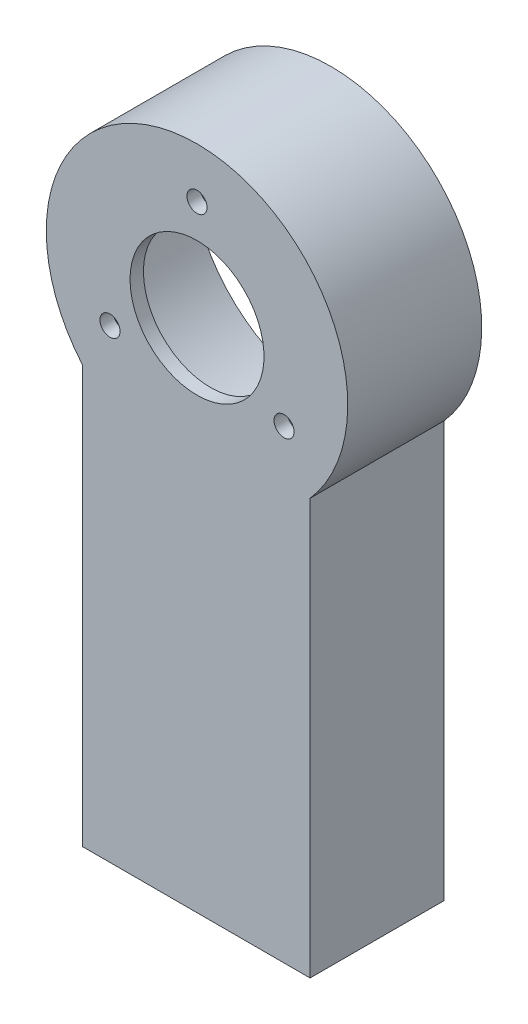
ISO-10303-21;
HEADER;
FILE_DESCRIPTION(('STEP AP214'),'2;1');
FILE_NAME('part.step','',(''),(''),'','','');
FILE_SCHEMA(('AUTOMOTIVE_DESIGN { 1 0 10303 214 1 1 1 1 }'));
ENDSEC;
DATA;
#1=APPLICATION_CONTEXT('core data for automotive mechanical design processes');
#2=APPLICATION_PROTOCOL_DEFINITION('international standard','automotive_design',2000,#1);
#3=PRODUCT_CONTEXT('',#1,'mechanical');
#4=PRODUCT('Part','Part','',(#3));
#5=PRODUCT_RELATED_PRODUCT_CATEGORY('part','',(#4));
#6=PRODUCT_DEFINITION_FORMATION('','',#4);
#7=PRODUCT_DEFINITION_CONTEXT('part definition',#1,'design');
#8=PRODUCT_DEFINITION('design','',#6,#7);
#9=PRODUCT_DEFINITION_SHAPE('','',#8);
#10=(LENGTH_UNIT() NAMED_UNIT(*) SI_UNIT(.MILLI.,.METRE.));
#11=(NAMED_UNIT(*) PLANE_ANGLE_UNIT() SI_UNIT($,.RADIAN.));
#12=(NAMED_UNIT(*) SI_UNIT($,.STERADIAN.) SOLID_ANGLE_UNIT());
#13=UNCERTAINTY_MEASURE_WITH_UNIT(LENGTH_MEASURE(1.E-05),#10,'distance_accuracy_value','');
#14=(GEOMETRIC_REPRESENTATION_CONTEXT(3) GLOBAL_UNCERTAINTY_ASSIGNED_CONTEXT((#13)) GLOBAL_UNIT_ASSIGNED_CONTEXT((#10,
#11,#12)) REPRESENTATION_CONTEXT('',''));
#15=CARTESIAN_POINT('',(0.,0.,0.));
#16=DIRECTION('',(0.,0.,1.));
#17=DIRECTION('',(1.,0.,0.));
#18=AXIS2_PLACEMENT_3D('',#15,#16,#17);
#19=CARTESIAN_POINT('',(0.,0.,20.));
#20=DIRECTION('',(0.,0.,-1.));
#21=DIRECTION('',(-1.,0.,0.));
#22=AXIS2_PLACEMENT_3D('',#19,#20,#21);
#23=CYLINDRICAL_SURFACE('',#22,10.);
#24=CARTESIAN_POINT('',(0.,0.,20.));
#25=DIRECTION('',(0.,0.,-1.));
#26=DIRECTION('',(-1.,0.,0.));
#27=AXIS2_PLACEMENT_3D('',#24,#25,#26);
#28=CIRCLE('',#27,10.);
#29=CARTESIAN_POINT('',(-10.,0.,20.));
#30=VERTEX_POINT('',#29);
#31=EDGE_CURVE('E103',#30,#30,#28,.T.);
#32=ORIENTED_EDGE('',*,*,#31,.F.);
#33=EDGE_LOOP('',(#32));
#34=FACE_BOUND('',#33,.T.);
#35=CARTESIAN_POINT('',(0.,0.,18.));
#36=DIRECTION('',(0.,0.,-1.));
#37=DIRECTION('',(-1.,0.,0.));
#38=AXIS2_PLACEMENT_3D('',#35,#36,#37);
#39=CIRCLE('',#38,10.);
#40=CARTESIAN_POINT('',(-10.,0.,18.));
#41=VERTEX_POINT('',#40);
#42=EDGE_CURVE('E243',#41,#41,#39,.F.);
#43=ORIENTED_EDGE('',*,*,#42,.F.);
#44=EDGE_LOOP('',(#43));
#45=FACE_BOUND('',#44,.T.);
#46=ADVANCED_FACE('F35',(#34,#45),#23,.F.);
#47=CARTESIAN_POINT('',(12.9903810567659,-7.50000000000037,20.));
#48=DIRECTION('',(0.,0.,-1.));
#49=DIRECTION('',(-1.,0.,0.));
#50=AXIS2_PLACEMENT_3D('',#47,#48,#49);
#51=CYLINDRICAL_SURFACE('',#50,1.50000000000086);
#52=CARTESIAN_POINT('',(12.9903810567659,-7.50000000000037,20.));
#53=DIRECTION('',(0.,0.,-1.));
#54=DIRECTION('',(-1.,0.,0.));
#55=AXIS2_PLACEMENT_3D('',#52,#53,#54);
#56=CIRCLE('',#55,1.50000000000086);
#57=CARTESIAN_POINT('',(11.4903810567651,-7.50000000000037,20.));
#58=VERTEX_POINT('',#57);
#59=EDGE_CURVE('E253',#58,#58,#56,.T.);
#60=ORIENTED_EDGE('',*,*,#59,.F.);
#61=EDGE_LOOP('',(#60));
#62=FACE_BOUND('',#61,.T.);
#63=CARTESIAN_POINT('',(12.9903810567659,-7.50000000000037,18.));
#64=DIRECTION('',(0.,0.,-1.));
#65=DIRECTION('',(-1.,0.,0.));
#66=AXIS2_PLACEMENT_3D('',#63,#64,#65);
#67=CIRCLE('',#66,1.50000000000086);
#68=CARTESIAN_POINT('',(11.4903810567651,-7.50000000000037,18.));
#69=VERTEX_POINT('',#68);
#70=EDGE_CURVE('E240',#69,#69,#67,.F.);
#71=ORIENTED_EDGE('',*,*,#70,.F.);
#72=EDGE_LOOP('',(#71));
#73=FACE_BOUND('',#72,.T.);
#74=ADVANCED_FACE('F124',(#62,#73),#51,.F.);
#75=CARTESIAN_POINT('',(-12.9903810567672,-7.49999999999963,20.));
#76=DIRECTION('',(0.,0.,-1.));
#77=DIRECTION('',(-1.,0.,0.));
#78=AXIS2_PLACEMENT_3D('',#75,#76,#77);
#79=CYLINDRICAL_SURFACE('',#78,1.50000000000057);
#80=CARTESIAN_POINT('',(-12.9903810567672,-7.49999999999963,20.));
#81=DIRECTION('',(0.,0.,-1.));
#82=DIRECTION('',(-1.,0.,0.));
#83=AXIS2_PLACEMENT_3D('',#80,#81,#82);
#84=CIRCLE('',#83,1.50000000000057);
#85=CARTESIAN_POINT('',(-14.4903810567678,-7.49999999999963,20.));
#86=VERTEX_POINT('',#85);
#87=EDGE_CURVE('E235',#86,#86,#84,.T.);
#88=ORIENTED_EDGE('',*,*,#87,.F.);
#89=EDGE_LOOP('',(#88));
#90=FACE_BOUND('',#89,.T.);
#91=CARTESIAN_POINT('',(-12.9903810567672,-7.49999999999963,18.));
#92=DIRECTION('',(0.,0.,-1.));
#93=DIRECTION('',(-1.,0.,0.));
#94=AXIS2_PLACEMENT_3D('',#91,#92,#93);
#95=CIRCLE('',#94,1.50000000000057);
#96=CARTESIAN_POINT('',(-14.4903810567678,-7.49999999999963,18.));
#97=VERTEX_POINT('',#96);
#98=EDGE_CURVE('E238',#97,#97,#95,.F.);
#99=ORIENTED_EDGE('',*,*,#98,.F.);
#100=EDGE_LOOP('',(#99));
#101=FACE_BOUND('',#100,.T.);
#102=ADVANCED_FACE('F120',(#90,#101),#79,.F.);
#103=CARTESIAN_POINT('',(0.,15.,20.));
#104=DIRECTION('',(0.,0.,-1.));
#105=DIRECTION('',(-1.,0.,0.));
#106=AXIS2_PLACEMENT_3D('',#103,#104,#105);
#107=CYLINDRICAL_SURFACE('',#106,1.5);
#108=CARTESIAN_POINT('',(0.,15.,20.));
#109=DIRECTION('',(0.,0.,-1.));
#110=DIRECTION('',(-1.,0.,0.));
#111=AXIS2_PLACEMENT_3D('',#108,#109,#110);
#112=CIRCLE('',#111,1.5);
#113=CARTESIAN_POINT('',(-1.5,15.,20.));
#114=VERTEX_POINT('',#113);
#115=EDGE_CURVE('E254',#114,#114,#112,.T.);
#116=ORIENTED_EDGE('',*,*,#115,.F.);
#117=EDGE_LOOP('',(#116));
#118=FACE_BOUND('',#117,.T.);
#119=CARTESIAN_POINT('',(0.,15.,18.));
#120=DIRECTION('',(0.,0.,-1.));
#121=DIRECTION('',(-1.,0.,0.));
#122=AXIS2_PLACEMENT_3D('',#119,#120,#121);
#123=CIRCLE('',#122,1.5);
#124=CARTESIAN_POINT('',(-1.5,15.,18.));
#125=VERTEX_POINT('',#124);
#126=EDGE_CURVE('E39',#125,#125,#123,.F.);
#127=ORIENTED_EDGE('',*,*,#126,.F.);
#128=EDGE_LOOP('',(#127));
#129=FACE_BOUND('',#128,.T.);
#130=ADVANCED_FACE('F115',(#118,#129),#107,.F.);
#131=CARTESIAN_POINT('',(16.8763744860903,0.,20.));
#132=DIRECTION('',(1.,0.,0.));
#133=DIRECTION('',(0.,1.,0.));
#134=AXIS2_PLACEMENT_3D('',#131,#132,#133);
#135=PLANE('',#134);
#136=DIRECTION('',(0.,-1.,0.));
#137=VECTOR('',#136,1.);
#138=CARTESIAN_POINT('',(16.8763744860903,0.,0.));
#139=LINE('',#138,#137);
#140=CARTESIAN_POINT('',(16.8763744860903,-14.8807924589129,0.));
#141=VERTEX_POINT('',#140);
#142=CARTESIAN_POINT('',(16.8763744860903,-76.9,0.));
#143=VERTEX_POINT('',#142);
#144=EDGE_CURVE('E100',#141,#143,#139,.T.);
#145=ORIENTED_EDGE('',*,*,#144,.F.);
#146=DIRECTION('',(0.,0.,-1.));
#147=VECTOR('',#146,1.);
#148=CARTESIAN_POINT('',(16.8763744860903,-14.8807924589129,20.));
#149=LINE('',#148,#147);
#150=CARTESIAN_POINT('',(16.8763744860903,-14.8807924589129,20.));
#151=VERTEX_POINT('',#150);
#152=EDGE_CURVE('E11',#151,#141,#149,.T.);
#153=ORIENTED_EDGE('',*,*,#152,.F.);
#154=DIRECTION('',(0.,-1.,0.));
#155=VECTOR('',#154,1.);
#156=CARTESIAN_POINT('',(16.8763744860903,0.,20.));
#157=LINE('',#156,#155);
#158=CARTESIAN_POINT('',(16.8763744860903,-76.9,20.));
#159=VERTEX_POINT('',#158);
#160=EDGE_CURVE('E87',#151,#159,#157,.T.);
#161=ORIENTED_EDGE('',*,*,#160,.T.);
#162=DIRECTION('',(0.,0.,-1.));
#163=VECTOR('',#162,1.);
#164=CARTESIAN_POINT('',(16.8763744860903,-76.9,20.));
#165=LINE('',#164,#163);
#166=EDGE_CURVE('E76',#159,#143,#165,.T.);
#167=ORIENTED_EDGE('',*,*,#166,.T.);
#168=EDGE_LOOP('',(#145,#153,#161,#167));
#169=FACE_BOUND('',#168,.T.);
#170=ADVANCED_FACE('F37',(#169),#135,.T.);
#171=CARTESIAN_POINT('',(0.,0.,20.));
#172=DIRECTION('',(0.,0.,-1.));
#173=DIRECTION('',(-1.,0.,0.));
#174=AXIS2_PLACEMENT_3D('',#171,#172,#173);
#175=CYLINDRICAL_SURFACE('',#174,22.5);
#176=CARTESIAN_POINT('',(0.,0.,0.));
#177=DIRECTION('',(0.,0.,1.));
#178=DIRECTION('',(1.,0.,0.));
#179=AXIS2_PLACEMENT_3D('',#176,#177,#178);
#180=CIRCLE('',#179,22.5);
#181=CARTESIAN_POINT('',(-17.1236255139097,-14.5955969134319,0.));
#182=VERTEX_POINT('',#181);
#183=EDGE_CURVE('E92',#141,#182,#180,.T.);
#184=ORIENTED_EDGE('',*,*,#183,.T.);
#185=DIRECTION('',(0.,0.,-1.));
#186=VECTOR('',#185,1.);
#187=CARTESIAN_POINT('',(-17.1236255139097,-14.5955969134319,20.));
#188=LINE('',#187,#186);
#189=CARTESIAN_POINT('',(-17.1236255139097,-14.5955969134319,20.));
#190=VERTEX_POINT('',#189);
#191=EDGE_CURVE('E45',#190,#182,#188,.T.);
#192=ORIENTED_EDGE('',*,*,#191,.F.);
#193=CARTESIAN_POINT('',(0.,0.,20.));
#194=DIRECTION('',(0.,0.,1.));
#195=DIRECTION('',(1.,0.,0.));
#196=AXIS2_PLACEMENT_3D('',#193,#194,#195);
#197=CIRCLE('',#196,22.5);
#198=EDGE_CURVE('E82',#151,#190,#197,.T.);
#199=ORIENTED_EDGE('',*,*,#198,.F.);
#200=ORIENTED_EDGE('',*,*,#152,.T.);
#201=EDGE_LOOP('',(#184,#192,#199,#200));
#202=FACE_BOUND('',#201,.T.);
#203=ADVANCED_FACE('F90',(#202),#175,.T.);
#204=CARTESIAN_POINT('',(-17.1236255139097,0.,20.));
#205=DIRECTION('',(1.,0.,0.));
#206=DIRECTION('',(0.,1.,0.));
#207=AXIS2_PLACEMENT_3D('',#204,#205,#206);
#208=PLANE('',#207);
#209=DIRECTION('',(0.,-1.,0.));
#210=VECTOR('',#209,1.);
#211=CARTESIAN_POINT('',(-17.1236255139097,0.,0.));
#212=LINE('',#211,#210);
#213=CARTESIAN_POINT('',(-17.1236255139097,-76.9,0.));
#214=VERTEX_POINT('',#213);
#215=EDGE_CURVE('E69',#182,#214,#212,.T.);
#216=ORIENTED_EDGE('',*,*,#215,.T.);
#217=DIRECTION('',(0.,0.,-1.));
#218=VECTOR('',#217,1.);
#219=CARTESIAN_POINT('',(-17.1236255139097,-76.9,20.));
#220=LINE('',#219,#218);
#221=CARTESIAN_POINT('',(-17.1236255139097,-76.9,20.));
#222=VERTEX_POINT('',#221);
#223=EDGE_CURVE('E93',#222,#214,#220,.T.);
#224=ORIENTED_EDGE('',*,*,#223,.F.);
#225=DIRECTION('',(0.,-1.,0.));
#226=VECTOR('',#225,1.);
#227=CARTESIAN_POINT('',(-17.1236255139097,0.,20.));
#228=LINE('',#227,#226);
#229=EDGE_CURVE('E86',#190,#222,#228,.T.);
#230=ORIENTED_EDGE('',*,*,#229,.F.);
#231=ORIENTED_EDGE('',*,*,#191,.T.);
#232=EDGE_LOOP('',(#216,#224,#230,#231));
#233=FACE_BOUND('',#232,.T.);
#234=ADVANCED_FACE('F95',(#233),#208,.F.);
#235=CARTESIAN_POINT('',(0.,-76.9,20.));
#236=DIRECTION('',(0.,1.,0.));
#237=DIRECTION('',(0.,0.,1.));
#238=AXIS2_PLACEMENT_3D('',#235,#236,#237);
#239=PLANE('',#238);
#240=DIRECTION('',(1.,0.,0.));
#241=VECTOR('',#240,1.);
#242=CARTESIAN_POINT('',(0.,-76.9,0.));
#243=LINE('',#242,#241);
#244=EDGE_CURVE('E106',#214,#143,#243,.T.);
#245=ORIENTED_EDGE('',*,*,#244,.T.);
#246=ORIENTED_EDGE('',*,*,#166,.F.);
#247=DIRECTION('',(1.,0.,0.));
#248=VECTOR('',#247,1.);
#249=CARTESIAN_POINT('',(0.,-76.9,20.));
#250=LINE('',#249,#248);
#251=EDGE_CURVE('E53',#222,#159,#250,.T.);
#252=ORIENTED_EDGE('',*,*,#251,.F.);
#253=ORIENTED_EDGE('',*,*,#223,.T.);
#254=EDGE_LOOP('',(#245,#246,#252,#253));
#255=FACE_BOUND('',#254,.T.);
#256=ADVANCED_FACE('F111',(#255),#239,.F.);
#257=CARTESIAN_POINT('',(0.,0.,20.));
#258=DIRECTION('',(0.,0.,1.));
#259=DIRECTION('',(1.,0.,0.));
#260=AXIS2_PLACEMENT_3D('',#257,#258,#259);
#261=PLANE('',#260);
#262=ORIENTED_EDGE('',*,*,#115,.T.);
#263=EDGE_LOOP('',(#262));
#264=FACE_BOUND('',#263,.T.);
#265=ORIENTED_EDGE('',*,*,#87,.T.);
#266=EDGE_LOOP('',(#265));
#267=FACE_BOUND('',#266,.T.);
#268=ORIENTED_EDGE('',*,*,#59,.T.);
#269=EDGE_LOOP('',(#268));
#270=FACE_BOUND('',#269,.T.);
#271=ORIENTED_EDGE('',*,*,#31,.T.);
#272=EDGE_LOOP('',(#271));
#273=FACE_BOUND('',#272,.T.);
#274=ORIENTED_EDGE('',*,*,#160,.F.);
#275=ORIENTED_EDGE('',*,*,#198,.T.);
#276=ORIENTED_EDGE('',*,*,#229,.T.);
#277=ORIENTED_EDGE('',*,*,#251,.T.);
#278=EDGE_LOOP('',(#274,#275,#276,#277));
#279=FACE_BOUND('',#278,.T.);
#280=ADVANCED_FACE('F84',(#264,#267,#270,#273,#279),#261,.T.);
#281=CARTESIAN_POINT('',(0.,0.,0.));
#282=DIRECTION('',(0.,0.,1.));
#283=DIRECTION('',(1.,0.,0.));
#284=AXIS2_PLACEMENT_3D('',#281,#282,#283);
#285=PLANE('',#284);
#286=CARTESIAN_POINT('',(0.,0.,0.));
#287=DIRECTION('',(0.,0.,-1.));
#288=DIRECTION('',(-1.,0.,0.));
#289=AXIS2_PLACEMENT_3D('',#286,#287,#288);
#290=CIRCLE('',#289,21.);
#291=CARTESIAN_POINT('',(-21.,0.,0.));
#292=VERTEX_POINT('',#291);
#293=EDGE_CURVE('E248',#292,#292,#290,.T.);
#294=ORIENTED_EDGE('',*,*,#293,.F.);
#295=EDGE_LOOP('',(#294));
#296=FACE_BOUND('',#295,.T.);
#297=ORIENTED_EDGE('',*,*,#144,.T.);
#298=ORIENTED_EDGE('',*,*,#244,.F.);
#299=ORIENTED_EDGE('',*,*,#215,.F.);
#300=ORIENTED_EDGE('',*,*,#183,.F.);
#301=EDGE_LOOP('',(#297,#298,#299,#300));
#302=FACE_BOUND('',#301,.T.);
#303=ADVANCED_FACE('F113',(#296,#302),#285,.F.);
#304=CARTESIAN_POINT('',(0.,0.,18.));
#305=DIRECTION('',(0.,0.,-1.));
#306=DIRECTION('',(-1.,0.,0.));
#307=AXIS2_PLACEMENT_3D('',#304,#305,#306);
#308=PLANE('',#307);
#309=CARTESIAN_POINT('',(0.,0.,18.));
#310=DIRECTION('',(0.,0.,-1.));
#311=DIRECTION('',(-1.,0.,0.));
#312=AXIS2_PLACEMENT_3D('',#309,#310,#311);
#313=CIRCLE('',#312,21.);
#314=CARTESIAN_POINT('',(-21.,0.,18.));
#315=VERTEX_POINT('',#314);
#316=EDGE_CURVE('E246',#315,#315,#313,.T.);
#317=ORIENTED_EDGE('',*,*,#316,.T.);
#318=EDGE_LOOP('',(#317));
#319=FACE_BOUND('',#318,.T.);
#320=ORIENTED_EDGE('',*,*,#126,.T.);
#321=EDGE_LOOP('',(#320));
#322=FACE_BOUND('',#321,.T.);
#323=ORIENTED_EDGE('',*,*,#98,.T.);
#324=EDGE_LOOP('',(#323));
#325=FACE_BOUND('',#324,.T.);
#326=ORIENTED_EDGE('',*,*,#70,.T.);
#327=EDGE_LOOP('',(#326));
#328=FACE_BOUND('',#327,.T.);
#329=ORIENTED_EDGE('',*,*,#42,.T.);
#330=EDGE_LOOP('',(#329));
#331=FACE_BOUND('',#330,.T.);
#332=ADVANCED_FACE('F141',(#319,#322,#325,#328,#331),#308,.T.);
#333=CARTESIAN_POINT('',(0.,0.,18.));
#334=DIRECTION('',(0.,0.,-1.));
#335=DIRECTION('',(-1.,0.,0.));
#336=AXIS2_PLACEMENT_3D('',#333,#334,#335);
#337=CYLINDRICAL_SURFACE('',#336,21.);
#338=ORIENTED_EDGE('',*,*,#316,.F.);
#339=EDGE_LOOP('',(#338));
#340=FACE_BOUND('',#339,.T.);
#341=ORIENTED_EDGE('',*,*,#293,.T.);
#342=EDGE_LOOP('',(#341));
#343=FACE_BOUND('',#342,.T.);
#344=ADVANCED_FACE('F169',(#340,#343),#337,.F.);
#345=CLOSED_SHELL('',(#46,#74,#102,#130,#170,#203,#234,#256,#280,#303,#332,#344));
#346=MANIFOLD_SOLID_BREP('B2',#345);
#347=ADVANCED_BREP_SHAPE_REPRESENTATION('',(#18,#346),#14);
#348=SHAPE_DEFINITION_REPRESENTATION(#9,#347);
ENDSEC;
END-ISO-10303-21;
